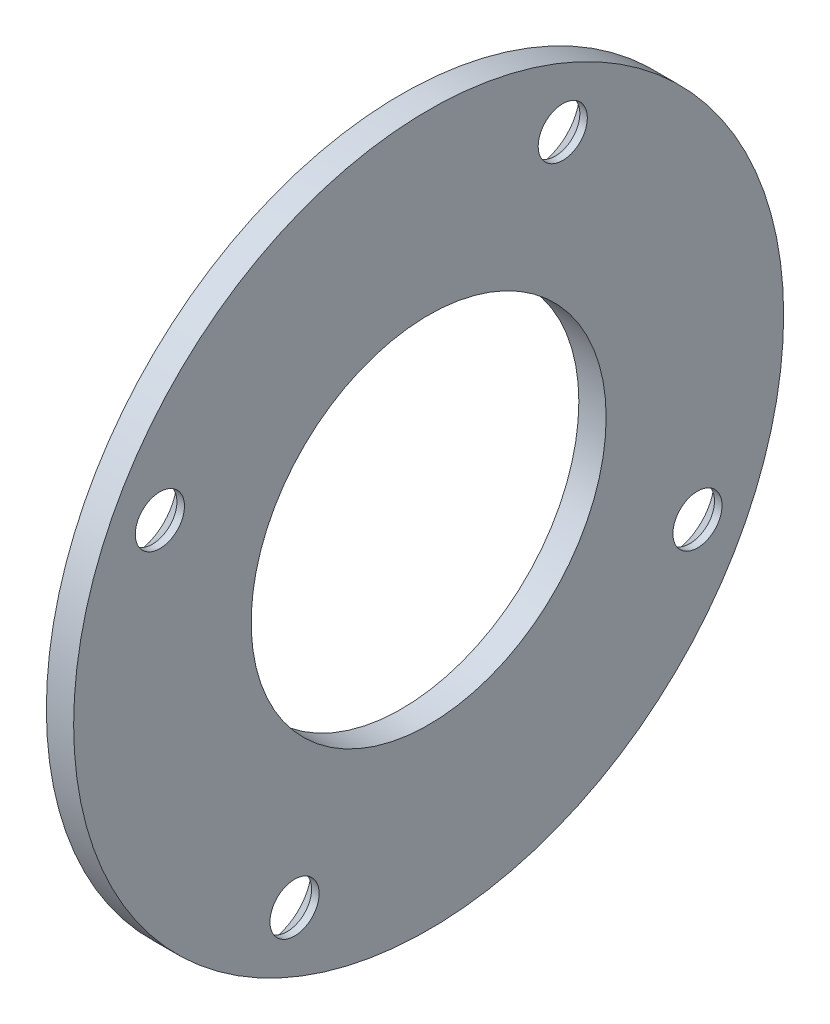
ISO-10303-21;
HEADER;
FILE_DESCRIPTION(('STEP AP214'),'2;1');
FILE_NAME('part.step','',(''),(''),'','','');
FILE_SCHEMA(('AUTOMOTIVE_DESIGN { 1 0 10303 214 1 1 1 1 }'));
ENDSEC;
DATA;
#1=APPLICATION_CONTEXT('core data for automotive mechanical design processes');
#2=APPLICATION_PROTOCOL_DEFINITION('international standard','automotive_design',2000,#1);
#3=PRODUCT_CONTEXT('',#1,'mechanical');
#4=PRODUCT('Part','Part','',(#3));
#5=PRODUCT_RELATED_PRODUCT_CATEGORY('part','',(#4));
#6=PRODUCT_DEFINITION_FORMATION('','',#4);
#7=PRODUCT_DEFINITION_CONTEXT('part definition',#1,'design');
#8=PRODUCT_DEFINITION('design','',#6,#7);
#9=PRODUCT_DEFINITION_SHAPE('','',#8);
#10=(LENGTH_UNIT() NAMED_UNIT(*) SI_UNIT(.MILLI.,.METRE.));
#11=(NAMED_UNIT(*) PLANE_ANGLE_UNIT() SI_UNIT($,.RADIAN.));
#12=(NAMED_UNIT(*) SI_UNIT($,.STERADIAN.) SOLID_ANGLE_UNIT());
#13=UNCERTAINTY_MEASURE_WITH_UNIT(LENGTH_MEASURE(1.E-05),#10,'distance_accuracy_value','');
#14=(GEOMETRIC_REPRESENTATION_CONTEXT(3) GLOBAL_UNCERTAINTY_ASSIGNED_CONTEXT((#13)) GLOBAL_UNIT_ASSIGNED_CONTEXT((#10,
#11,#12)) REPRESENTATION_CONTEXT('',''));
#15=CARTESIAN_POINT('',(0.,0.,0.));
#16=DIRECTION('',(0.,0.,1.));
#17=DIRECTION('',(1.,0.,0.));
#18=AXIS2_PLACEMENT_3D('',#15,#16,#17);
#19=CARTESIAN_POINT('',(2.,0.,0.));
#20=DIRECTION('',(1.,0.,0.));
#21=DIRECTION('',(0.,0.,-1.));
#22=AXIS2_PLACEMENT_3D('',#19,#20,#21);
#23=PLANE('',#22);
#24=CARTESIAN_POINT('',(2.,19.6860042843396,-9.82146808358935));
#25=DIRECTION('',(1.,0.,0.));
#26=DIRECTION('',(0.,0.,-1.));
#27=AXIS2_PLACEMENT_3D('',#24,#25,#26);
#28=CIRCLE('',#27,1.8);
#29=CARTESIAN_POINT('',(2.,19.6860042843396,-11.6214680835894));
#30=VERTEX_POINT('',#29);
#31=EDGE_CURVE('E76',#30,#30,#28,.T.);
#32=ORIENTED_EDGE('',*,*,#31,.F.);
#33=EDGE_LOOP('',(#32));
#34=FACE_BOUND('',#33,.T.);
#35=CARTESIAN_POINT('',(2.,-9.82146808358956,-19.6860042843395));
#36=DIRECTION('',(1.,0.,0.));
#37=DIRECTION('',(0.,0.,-1.));
#38=AXIS2_PLACEMENT_3D('',#35,#36,#37);
#39=CIRCLE('',#38,1.8);
#40=CARTESIAN_POINT('',(2.,-9.82146808358956,-21.4860042843395));
#41=VERTEX_POINT('',#40);
#42=EDGE_CURVE('E67',#41,#41,#39,.T.);
#43=ORIENTED_EDGE('',*,*,#42,.F.);
#44=EDGE_LOOP('',(#43));
#45=FACE_BOUND('',#44,.T.);
#46=CARTESIAN_POINT('',(2.,-19.6860042843395,9.82146808358949));
#47=DIRECTION('',(1.,0.,0.));
#48=DIRECTION('',(0.,0.,-1.));
#49=AXIS2_PLACEMENT_3D('',#46,#47,#48);
#50=CIRCLE('',#49,1.8);
#51=CARTESIAN_POINT('',(2.,-19.6860042843395,8.02146808358949));
#52=VERTEX_POINT('',#51);
#53=EDGE_CURVE('E58',#52,#52,#50,.T.);
#54=ORIENTED_EDGE('',*,*,#53,.F.);
#55=EDGE_LOOP('',(#54));
#56=FACE_BOUND('',#55,.T.);
#57=CARTESIAN_POINT('',(2.,9.82146808358956,19.6860042843395));
#58=DIRECTION('',(1.,0.,0.));
#59=DIRECTION('',(0.,0.,-1.));
#60=AXIS2_PLACEMENT_3D('',#57,#58,#59);
#61=CIRCLE('',#60,1.8);
#62=CARTESIAN_POINT('',(2.,9.82146808358956,17.8860042843395));
#63=VERTEX_POINT('',#62);
#64=EDGE_CURVE('E47',#63,#63,#61,.T.);
#65=ORIENTED_EDGE('',*,*,#64,.F.);
#66=EDGE_LOOP('',(#65));
#67=FACE_BOUND('',#66,.T.);
#68=CARTESIAN_POINT('',(2.,0.,0.));
#69=DIRECTION('',(1.,0.,0.));
#70=DIRECTION('',(0.,0.,-1.));
#71=AXIS2_PLACEMENT_3D('',#68,#69,#70);
#72=CIRCLE('',#71,26.);
#73=CARTESIAN_POINT('',(2.,0.,-26.));
#74=VERTEX_POINT('',#73);
#75=EDGE_CURVE('E10',#74,#74,#72,.T.);
#76=ORIENTED_EDGE('',*,*,#75,.T.);
#77=EDGE_LOOP('',(#76));
#78=FACE_BOUND('',#77,.T.);
#79=CARTESIAN_POINT('',(2.,0.,0.));
#80=DIRECTION('',(1.,0.,0.));
#81=DIRECTION('',(0.,0.,-1.));
#82=AXIS2_PLACEMENT_3D('',#79,#80,#81);
#83=CIRCLE('',#82,13.);
#84=CARTESIAN_POINT('',(2.,0.,-13.));
#85=VERTEX_POINT('',#84);
#86=EDGE_CURVE('E42',#85,#85,#83,.T.);
#87=ORIENTED_EDGE('',*,*,#86,.F.);
#88=EDGE_LOOP('',(#87));
#89=FACE_BOUND('',#88,.T.);
#90=ADVANCED_FACE('F31',(#34,#45,#56,#67,#78,#89),#23,.T.);
#91=CARTESIAN_POINT('',(0.,0.,0.));
#92=DIRECTION('',(1.,0.,0.));
#93=DIRECTION('',(0.,0.,-1.));
#94=AXIS2_PLACEMENT_3D('',#91,#92,#93);
#95=PLANE('',#94);
#96=CARTESIAN_POINT('',(0.,19.6860042843396,-9.82146808358935));
#97=DIRECTION('',(-1.,0.,0.));
#98=DIRECTION('',(0.,0.,1.));
#99=AXIS2_PLACEMENT_3D('',#96,#97,#98);
#100=CIRCLE('',#99,3.25);
#101=CARTESIAN_POINT('',(0.,19.6860042843396,-6.57146808358935));
#102=VERTEX_POINT('',#101);
#103=EDGE_CURVE('E82',#102,#102,#100,.T.);
#104=ORIENTED_EDGE('',*,*,#103,.F.);
#105=EDGE_LOOP('',(#104));
#106=FACE_BOUND('',#105,.T.);
#107=CARTESIAN_POINT('',(0.,-9.82146808358956,-19.6860042843395));
#108=DIRECTION('',(-1.,0.,0.));
#109=DIRECTION('',(0.,0.,1.));
#110=AXIS2_PLACEMENT_3D('',#107,#108,#109);
#111=CIRCLE('',#110,3.25);
#112=CARTESIAN_POINT('',(0.,-9.82146808358956,-16.4360042843395));
#113=VERTEX_POINT('',#112);
#114=EDGE_CURVE('E73',#113,#113,#111,.T.);
#115=ORIENTED_EDGE('',*,*,#114,.F.);
#116=EDGE_LOOP('',(#115));
#117=FACE_BOUND('',#116,.T.);
#118=CARTESIAN_POINT('',(0.,-19.6860042843395,9.82146808358949));
#119=DIRECTION('',(-1.,0.,0.));
#120=DIRECTION('',(0.,0.,1.));
#121=AXIS2_PLACEMENT_3D('',#118,#119,#120);
#122=CIRCLE('',#121,3.25);
#123=CARTESIAN_POINT('',(0.,-19.6860042843395,13.0714680835895));
#124=VERTEX_POINT('',#123);
#125=EDGE_CURVE('E64',#124,#124,#122,.T.);
#126=ORIENTED_EDGE('',*,*,#125,.F.);
#127=EDGE_LOOP('',(#126));
#128=FACE_BOUND('',#127,.T.);
#129=CARTESIAN_POINT('',(0.,9.82146808358956,19.6860042843395));
#130=DIRECTION('',(-1.,0.,0.));
#131=DIRECTION('',(0.,0.,1.));
#132=AXIS2_PLACEMENT_3D('',#129,#130,#131);
#133=CIRCLE('',#132,3.25);
#134=CARTESIAN_POINT('',(0.,9.82146808358956,22.9360042843395));
#135=VERTEX_POINT('',#134);
#136=EDGE_CURVE('E55',#135,#135,#133,.T.);
#137=ORIENTED_EDGE('',*,*,#136,.F.);
#138=EDGE_LOOP('',(#137));
#139=FACE_BOUND('',#138,.T.);
#140=CARTESIAN_POINT('',(0.,0.,0.));
#141=DIRECTION('',(1.,0.,0.));
#142=DIRECTION('',(0.,0.,-1.));
#143=AXIS2_PLACEMENT_3D('',#140,#141,#142);
#144=CIRCLE('',#143,26.);
#145=CARTESIAN_POINT('',(0.,0.,-26.));
#146=VERTEX_POINT('',#145);
#147=EDGE_CURVE('E35',#146,#146,#144,.T.);
#148=ORIENTED_EDGE('',*,*,#147,.F.);
#149=EDGE_LOOP('',(#148));
#150=FACE_BOUND('',#149,.T.);
#151=CARTESIAN_POINT('',(0.,0.,0.));
#152=DIRECTION('',(1.,0.,0.));
#153=DIRECTION('',(0.,0.,-1.));
#154=AXIS2_PLACEMENT_3D('',#151,#152,#153);
#155=CIRCLE('',#154,13.);
#156=CARTESIAN_POINT('',(0.,0.,-13.));
#157=VERTEX_POINT('',#156);
#158=EDGE_CURVE('E44',#157,#157,#155,.T.);
#159=ORIENTED_EDGE('',*,*,#158,.T.);
#160=EDGE_LOOP('',(#159));
#161=FACE_BOUND('',#160,.T.);
#162=ADVANCED_FACE('F88',(#106,#117,#128,#139,#150,#161),#95,.F.);
#163=CARTESIAN_POINT('',(2.,0.,0.));
#164=DIRECTION('',(-1.,0.,0.));
#165=DIRECTION('',(0.,0.,1.));
#166=AXIS2_PLACEMENT_3D('',#163,#164,#165);
#167=CYLINDRICAL_SURFACE('',#166,26.);
#168=ORIENTED_EDGE('',*,*,#75,.F.);
#169=EDGE_LOOP('',(#168));
#170=FACE_BOUND('',#169,.T.);
#171=ORIENTED_EDGE('',*,*,#147,.T.);
#172=EDGE_LOOP('',(#171));
#173=FACE_BOUND('',#172,.T.);
#174=ADVANCED_FACE('F33',(#170,#173),#167,.T.);
#175=CARTESIAN_POINT('',(2.,0.,0.));
#176=DIRECTION('',(-1.,0.,0.));
#177=DIRECTION('',(0.,0.,1.));
#178=AXIS2_PLACEMENT_3D('',#175,#176,#177);
#179=CYLINDRICAL_SURFACE('',#178,13.);
#180=ORIENTED_EDGE('',*,*,#86,.T.);
#181=EDGE_LOOP('',(#180));
#182=FACE_BOUND('',#181,.T.);
#183=ORIENTED_EDGE('',*,*,#158,.F.);
#184=EDGE_LOOP('',(#183));
#185=FACE_BOUND('',#184,.T.);
#186=ADVANCED_FACE('F101',(#182,#185),#179,.F.);
#187=CARTESIAN_POINT('',(0.,9.82146808358956,19.6860042843395));
#188=DIRECTION('',(-1.,0.,0.));
#189=DIRECTION('',(0.,0.,1.));
#190=AXIS2_PLACEMENT_3D('',#187,#188,#189);
#191=CYLINDRICAL_SURFACE('',#190,1.8);
#192=CARTESIAN_POINT('',(1.45,9.82146808358956,19.6860042843395));
#193=DIRECTION('',(-1.,0.,0.));
#194=DIRECTION('',(0.,0.,1.));
#195=AXIS2_PLACEMENT_3D('',#192,#193,#194);
#196=CIRCLE('',#195,1.8);
#197=CARTESIAN_POINT('',(1.45,9.82146808358956,21.4860042843395));
#198=VERTEX_POINT('',#197);
#199=EDGE_CURVE('E52',#198,#198,#196,.T.);
#200=ORIENTED_EDGE('',*,*,#199,.T.);
#201=EDGE_LOOP('',(#200));
#202=FACE_BOUND('',#201,.T.);
#203=ORIENTED_EDGE('',*,*,#64,.T.);
#204=EDGE_LOOP('',(#203));
#205=FACE_BOUND('',#204,.T.);
#206=ADVANCED_FACE('F103',(#202,#205),#191,.F.);
#207=CARTESIAN_POINT('',(0.,9.82146808358956,19.6860042843395));
#208=DIRECTION('',(-1.,0.,0.));
#209=DIRECTION('',(0.,0.,1.));
#210=AXIS2_PLACEMENT_3D('',#207,#208,#209);
#211=CONICAL_SURFACE('',#210,3.25,0.785398163397449);
#212=ORIENTED_EDGE('',*,*,#199,.F.);
#213=EDGE_LOOP('',(#212));
#214=FACE_BOUND('',#213,.T.);
#215=ORIENTED_EDGE('',*,*,#136,.T.);
#216=EDGE_LOOP('',(#215));
#217=FACE_BOUND('',#216,.T.);
#218=ADVANCED_FACE('F110',(#214,#217),#211,.F.);
#219=CARTESIAN_POINT('',(0.,-19.6860042843395,9.82146808358949));
#220=DIRECTION('',(-1.,0.,0.));
#221=DIRECTION('',(0.,0.,1.));
#222=AXIS2_PLACEMENT_3D('',#219,#220,#221);
#223=CYLINDRICAL_SURFACE('',#222,1.8);
#224=CARTESIAN_POINT('',(1.45,-19.6860042843395,9.82146808358949));
#225=DIRECTION('',(-1.,0.,0.));
#226=DIRECTION('',(0.,0.,1.));
#227=AXIS2_PLACEMENT_3D('',#224,#225,#226);
#228=CIRCLE('',#227,1.8);
#229=CARTESIAN_POINT('',(1.45,-19.6860042843395,11.6214680835895));
#230=VERTEX_POINT('',#229);
#231=EDGE_CURVE('E61',#230,#230,#228,.T.);
#232=ORIENTED_EDGE('',*,*,#231,.T.);
#233=EDGE_LOOP('',(#232));
#234=FACE_BOUND('',#233,.T.);
#235=ORIENTED_EDGE('',*,*,#53,.T.);
#236=EDGE_LOOP('',(#235));
#237=FACE_BOUND('',#236,.T.);
#238=ADVANCED_FACE('F130',(#234,#237),#223,.F.);
#239=CARTESIAN_POINT('',(0.,-19.6860042843395,9.82146808358949));
#240=DIRECTION('',(-1.,0.,0.));
#241=DIRECTION('',(0.,0.,1.));
#242=AXIS2_PLACEMENT_3D('',#239,#240,#241);
#243=CONICAL_SURFACE('',#242,3.25,0.785398163397448);
#244=ORIENTED_EDGE('',*,*,#231,.F.);
#245=EDGE_LOOP('',(#244));
#246=FACE_BOUND('',#245,.T.);
#247=ORIENTED_EDGE('',*,*,#125,.T.);
#248=EDGE_LOOP('',(#247));
#249=FACE_BOUND('',#248,.T.);
#250=ADVANCED_FACE('F132',(#246,#249),#243,.F.);
#251=CARTESIAN_POINT('',(0.,-9.82146808358956,-19.6860042843395));
#252=DIRECTION('',(-1.,0.,0.));
#253=DIRECTION('',(0.,0.,1.));
#254=AXIS2_PLACEMENT_3D('',#251,#252,#253);
#255=CYLINDRICAL_SURFACE('',#254,1.8);
#256=CARTESIAN_POINT('',(1.45,-9.82146808358956,-19.6860042843395));
#257=DIRECTION('',(-1.,0.,0.));
#258=DIRECTION('',(0.,0.,1.));
#259=AXIS2_PLACEMENT_3D('',#256,#257,#258);
#260=CIRCLE('',#259,1.8);
#261=CARTESIAN_POINT('',(1.45,-9.82146808358956,-17.8860042843395));
#262=VERTEX_POINT('',#261);
#263=EDGE_CURVE('E70',#262,#262,#260,.T.);
#264=ORIENTED_EDGE('',*,*,#263,.T.);
#265=EDGE_LOOP('',(#264));
#266=FACE_BOUND('',#265,.T.);
#267=ORIENTED_EDGE('',*,*,#42,.T.);
#268=EDGE_LOOP('',(#267));
#269=FACE_BOUND('',#268,.T.);
#270=ADVANCED_FACE('F139',(#266,#269),#255,.F.);
#271=CARTESIAN_POINT('',(0.,-9.82146808358956,-19.6860042843395));
#272=DIRECTION('',(-1.,0.,0.));
#273=DIRECTION('',(0.,0.,1.));
#274=AXIS2_PLACEMENT_3D('',#271,#272,#273);
#275=CONICAL_SURFACE('',#274,3.25,0.785398163397449);
#276=ORIENTED_EDGE('',*,*,#263,.F.);
#277=EDGE_LOOP('',(#276));
#278=FACE_BOUND('',#277,.T.);
#279=ORIENTED_EDGE('',*,*,#114,.T.);
#280=EDGE_LOOP('',(#279));
#281=FACE_BOUND('',#280,.T.);
#282=ADVANCED_FACE('F147',(#278,#281),#275,.F.);
#283=CARTESIAN_POINT('',(0.,19.6860042843396,-9.82146808358935));
#284=DIRECTION('',(-1.,0.,0.));
#285=DIRECTION('',(0.,0.,1.));
#286=AXIS2_PLACEMENT_3D('',#283,#284,#285);
#287=CYLINDRICAL_SURFACE('',#286,1.8);
#288=CARTESIAN_POINT('',(1.45,19.6860042843396,-9.82146808358935));
#289=DIRECTION('',(-1.,0.,0.));
#290=DIRECTION('',(0.,0.,1.));
#291=AXIS2_PLACEMENT_3D('',#288,#289,#290);
#292=CIRCLE('',#291,1.8);
#293=CARTESIAN_POINT('',(1.45,19.6860042843396,-8.02146808358935));
#294=VERTEX_POINT('',#293);
#295=EDGE_CURVE('E79',#294,#294,#292,.T.);
#296=ORIENTED_EDGE('',*,*,#295,.T.);
#297=EDGE_LOOP('',(#296));
#298=FACE_BOUND('',#297,.T.);
#299=ORIENTED_EDGE('',*,*,#31,.T.);
#300=EDGE_LOOP('',(#299));
#301=FACE_BOUND('',#300,.T.);
#302=ADVANCED_FACE('F151',(#298,#301),#287,.F.);
#303=CARTESIAN_POINT('',(0.,19.6860042843396,-9.82146808358935));
#304=DIRECTION('',(-1.,0.,0.));
#305=DIRECTION('',(0.,0.,1.));
#306=AXIS2_PLACEMENT_3D('',#303,#304,#305);
#307=CONICAL_SURFACE('',#306,3.25,0.785398163397448);
#308=ORIENTED_EDGE('',*,*,#295,.F.);
#309=EDGE_LOOP('',(#308));
#310=FACE_BOUND('',#309,.T.);
#311=ORIENTED_EDGE('',*,*,#103,.T.);
#312=EDGE_LOOP('',(#311));
#313=FACE_BOUND('',#312,.T.);
#314=ADVANCED_FACE('F86',(#310,#313),#307,.F.);
#315=CLOSED_SHELL('',(#90,#162,#174,#186,#206,#218,#238,#250,#270,#282,#302,#314));
#316=MANIFOLD_SOLID_BREP('B2',#315);
#317=ADVANCED_BREP_SHAPE_REPRESENTATION('',(#18,#316),#14);
#318=SHAPE_DEFINITION_REPRESENTATION(#9,#317);
ENDSEC;
END-ISO-10303-21;
